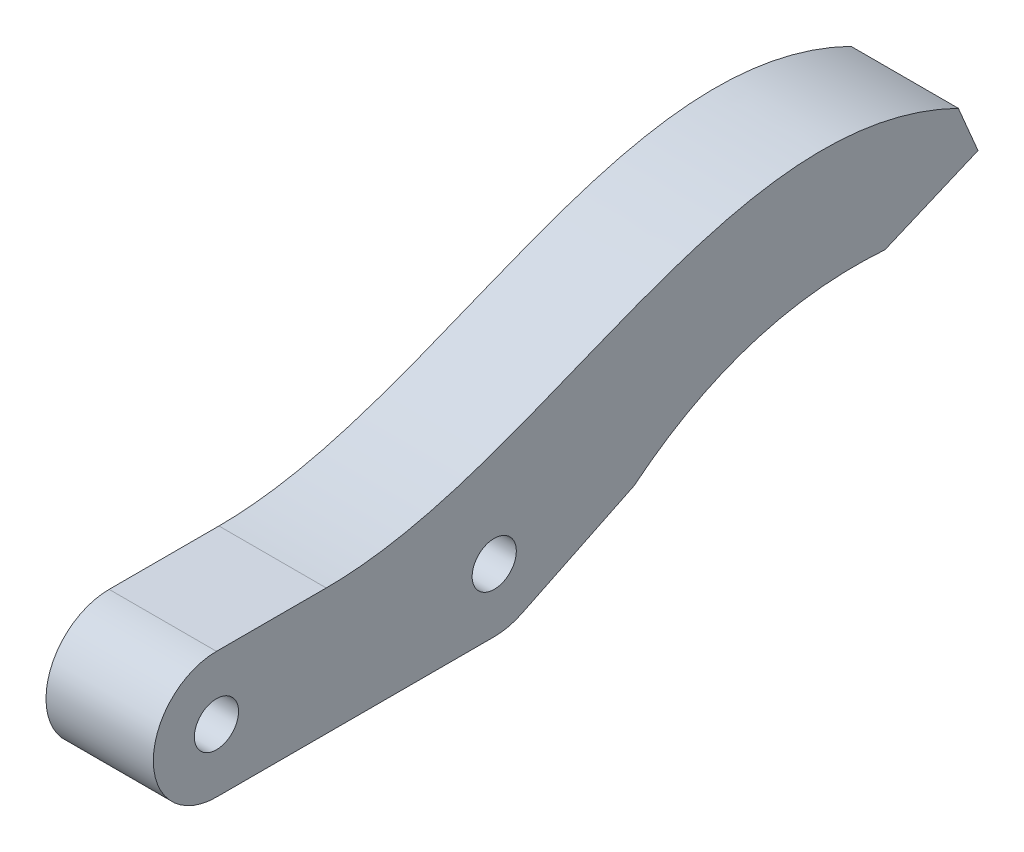
ISO-10303-21;
HEADER;
FILE_DESCRIPTION(('STEP AP214'),'2;1');
FILE_NAME('part.step','',(''),(''),'','','');
FILE_SCHEMA(('AUTOMOTIVE_DESIGN { 1 0 10303 214 1 1 1 1 }'));
ENDSEC;
DATA;
#1=APPLICATION_CONTEXT('core data for automotive mechanical design processes');
#2=APPLICATION_PROTOCOL_DEFINITION('international standard','automotive_design',2000,#1);
#3=PRODUCT_CONTEXT('',#1,'mechanical');
#4=PRODUCT('Part','Part','',(#3));
#5=PRODUCT_RELATED_PRODUCT_CATEGORY('part','',(#4));
#6=PRODUCT_DEFINITION_FORMATION('','',#4);
#7=PRODUCT_DEFINITION_CONTEXT('part definition',#1,'design');
#8=PRODUCT_DEFINITION('design','',#6,#7);
#9=PRODUCT_DEFINITION_SHAPE('','',#8);
#10=(LENGTH_UNIT() NAMED_UNIT(*) SI_UNIT(.MILLI.,.METRE.));
#11=(NAMED_UNIT(*) PLANE_ANGLE_UNIT() SI_UNIT($,.RADIAN.));
#12=(NAMED_UNIT(*) SI_UNIT($,.STERADIAN.) SOLID_ANGLE_UNIT());
#13=UNCERTAINTY_MEASURE_WITH_UNIT(LENGTH_MEASURE(1.E-05),#10,'distance_accuracy_value','');
#14=(GEOMETRIC_REPRESENTATION_CONTEXT(3) GLOBAL_UNCERTAINTY_ASSIGNED_CONTEXT((#13)) GLOBAL_UNIT_ASSIGNED_CONTEXT((#10,
#11,#12)) REPRESENTATION_CONTEXT('',''));
#15=CARTESIAN_POINT('',(0.,0.,0.));
#16=DIRECTION('',(0.,0.,1.));
#17=DIRECTION('',(1.,0.,0.));
#18=AXIS2_PLACEMENT_3D('',#15,#16,#17);
#19=CARTESIAN_POINT('',(8.5,5.,-27.));
#20=DIRECTION('',(-1.,0.,0.));
#21=DIRECTION('',(0.,0.,1.));
#22=AXIS2_PLACEMENT_3D('',#19,#20,#21);
#23=CYLINDRICAL_SURFACE('',#22,5.);
#24=DIRECTION('',(1.,0.,0.));
#25=VECTOR('',#24,1.);
#26=CARTESIAN_POINT('',(0.,0.502127655445501,-29.1838370754458));
#27=LINE('',#26,#25);
#28=CARTESIAN_POINT('',(0.,0.502127655445501,-29.1838370754458));
#29=VERTEX_POINT('',#28);
#30=CARTESIAN_POINT('',(8.5,0.502127655445501,-29.1838370754458));
#31=VERTEX_POINT('',#30);
#32=EDGE_CURVE('E200',#29,#31,#27,.T.);
#33=ORIENTED_EDGE('',*,*,#32,.T.);
#34=CARTESIAN_POINT('',(8.5,5.,-27.));
#35=DIRECTION('',(1.,0.,0.));
#36=DIRECTION('',(0.,0.,-1.));
#37=AXIS2_PLACEMENT_3D('',#34,#35,#36);
#38=CIRCLE('',#37,5.);
#39=CARTESIAN_POINT('',(8.5,0.,-27.));
#40=VERTEX_POINT('',#39);
#41=EDGE_CURVE('E212',#40,#31,#38,.T.);
#42=ORIENTED_EDGE('',*,*,#41,.F.);
#43=DIRECTION('',(-1.,0.,0.));
#44=VECTOR('',#43,1.);
#45=CARTESIAN_POINT('',(8.5,0.,-27.));
#46=LINE('',#45,#44);
#47=CARTESIAN_POINT('',(0.,0.,-27.));
#48=VERTEX_POINT('',#47);
#49=EDGE_CURVE('E220',#40,#48,#46,.T.);
#50=ORIENTED_EDGE('',*,*,#49,.T.);
#51=CARTESIAN_POINT('',(0.,5.,-27.));
#52=DIRECTION('',(1.,0.,0.));
#53=DIRECTION('',(0.,0.,-1.));
#54=AXIS2_PLACEMENT_3D('',#51,#52,#53);
#55=CIRCLE('',#54,5.);
#56=EDGE_CURVE('E224',#48,#29,#55,.T.);
#57=ORIENTED_EDGE('',*,*,#56,.T.);
#58=EDGE_LOOP('',(#33,#42,#50,#57));
#59=FACE_BOUND('',#58,.T.);
#60=ADVANCED_FACE('F45',(#59),#23,.T.);
#61=CARTESIAN_POINT('',(8.5,10.,0.));
#62=DIRECTION('',(0.,1.,0.));
#63=DIRECTION('',(0.,0.,1.));
#64=AXIS2_PLACEMENT_3D('',#61,#62,#63);
#65=PLANE('',#64);
#66=DIRECTION('',(1.,0.,0.));
#67=VECTOR('',#66,1.);
#68=CARTESIAN_POINT('',(0.,10.,-13.6949747586838));
#69=LINE('',#68,#67);
#70=CARTESIAN_POINT('',(0.,10.,-13.6949747586838));
#71=VERTEX_POINT('',#70);
#72=CARTESIAN_POINT('',(8.5,10.,-13.6949747586838));
#73=VERTEX_POINT('',#72);
#74=EDGE_CURVE('E135',#71,#73,#69,.T.);
#75=ORIENTED_EDGE('',*,*,#74,.F.);
#76=DIRECTION('',(0.,0.,-1.));
#77=VECTOR('',#76,1.);
#78=CARTESIAN_POINT('',(0.,10.,0.));
#79=LINE('',#78,#77);
#80=CARTESIAN_POINT('',(0.,10.,-5.));
#81=VERTEX_POINT('',#80);
#82=EDGE_CURVE('E146',#81,#71,#79,.T.);
#83=ORIENTED_EDGE('',*,*,#82,.F.);
#84=DIRECTION('',(-1.,0.,0.));
#85=VECTOR('',#84,1.);
#86=CARTESIAN_POINT('',(8.5,10.,-5.));
#87=LINE('',#86,#85);
#88=CARTESIAN_POINT('',(8.5,10.,-5.));
#89=VERTEX_POINT('',#88);
#90=EDGE_CURVE('E11',#89,#81,#87,.T.);
#91=ORIENTED_EDGE('',*,*,#90,.F.);
#92=DIRECTION('',(0.,0.,-1.));
#93=VECTOR('',#92,1.);
#94=CARTESIAN_POINT('',(8.5,10.,0.));
#95=LINE('',#94,#93);
#96=EDGE_CURVE('E199',#89,#73,#95,.T.);
#97=ORIENTED_EDGE('',*,*,#96,.T.);
#98=EDGE_LOOP('',(#75,#83,#91,#97));
#99=FACE_BOUND('',#98,.T.);
#100=ADVANCED_FACE('F47',(#99),#65,.T.);
#101=CARTESIAN_POINT('',(8.5,5.,-5.));
#102=DIRECTION('',(-1.,0.,0.));
#103=DIRECTION('',(0.,0.,1.));
#104=AXIS2_PLACEMENT_3D('',#101,#102,#103);
#105=CYLINDRICAL_SURFACE('',#104,5.);
#106=CARTESIAN_POINT('',(0.,5.,-5.));
#107=DIRECTION('',(1.,0.,0.));
#108=DIRECTION('',(0.,0.,-1.));
#109=AXIS2_PLACEMENT_3D('',#106,#107,#108);
#110=CIRCLE('',#109,5.);
#111=CARTESIAN_POINT('',(0.,0.,-5.));
#112=VERTEX_POINT('',#111);
#113=EDGE_CURVE('E75',#81,#112,#110,.T.);
#114=ORIENTED_EDGE('',*,*,#113,.T.);
#115=DIRECTION('',(-1.,0.,0.));
#116=VECTOR('',#115,1.);
#117=CARTESIAN_POINT('',(8.5,0.,-5.));
#118=LINE('',#117,#116);
#119=CARTESIAN_POINT('',(8.5,0.,-5.));
#120=VERTEX_POINT('',#119);
#121=EDGE_CURVE('E54',#120,#112,#118,.T.);
#122=ORIENTED_EDGE('',*,*,#121,.F.);
#123=CARTESIAN_POINT('',(8.5,5.,-5.));
#124=DIRECTION('',(1.,0.,0.));
#125=DIRECTION('',(0.,0.,-1.));
#126=AXIS2_PLACEMENT_3D('',#123,#124,#125);
#127=CIRCLE('',#126,5.);
#128=EDGE_CURVE('E208',#89,#120,#127,.T.);
#129=ORIENTED_EDGE('',*,*,#128,.F.);
#130=ORIENTED_EDGE('',*,*,#90,.T.);
#131=EDGE_LOOP('',(#114,#122,#129,#130));
#132=FACE_BOUND('',#131,.T.);
#133=ADVANCED_FACE('F191',(#132),#105,.T.);
#134=CARTESIAN_POINT('',(8.5,0.,0.));
#135=DIRECTION('',(0.,1.,0.));
#136=DIRECTION('',(0.,0.,1.));
#137=AXIS2_PLACEMENT_3D('',#134,#135,#136);
#138=PLANE('',#137);
#139=DIRECTION('',(0.,0.,-1.));
#140=VECTOR('',#139,1.);
#141=CARTESIAN_POINT('',(0.,0.,0.));
#142=LINE('',#141,#140);
#143=EDGE_CURVE('E80',#112,#48,#142,.T.);
#144=ORIENTED_EDGE('',*,*,#143,.T.);
#145=ORIENTED_EDGE('',*,*,#49,.F.);
#146=DIRECTION('',(0.,0.,-1.));
#147=VECTOR('',#146,1.);
#148=CARTESIAN_POINT('',(8.5,0.,0.));
#149=LINE('',#148,#147);
#150=EDGE_CURVE('E62',#120,#40,#149,.T.);
#151=ORIENTED_EDGE('',*,*,#150,.F.);
#152=ORIENTED_EDGE('',*,*,#121,.T.);
#153=EDGE_LOOP('',(#144,#145,#151,#152));
#154=FACE_BOUND('',#153,.T.);
#155=ADVANCED_FACE('F185',(#154),#138,.F.);
#156=CARTESIAN_POINT('',(8.5,5.,-5.));
#157=DIRECTION('',(-1.,0.,0.));
#158=DIRECTION('',(0.,0.,1.));
#159=AXIS2_PLACEMENT_3D('',#156,#157,#158);
#160=CYLINDRICAL_SURFACE('',#159,1.75);
#161=CARTESIAN_POINT('',(8.5,5.,-5.));
#162=DIRECTION('',(1.,0.,0.));
#163=DIRECTION('',(0.,0.,-1.));
#164=AXIS2_PLACEMENT_3D('',#161,#162,#163);
#165=CIRCLE('',#164,1.75);
#166=CARTESIAN_POINT('',(8.5,5.,-6.75));
#167=VERTEX_POINT('',#166);
#168=EDGE_CURVE('E214',#167,#167,#165,.T.);
#169=ORIENTED_EDGE('',*,*,#168,.T.);
#170=EDGE_LOOP('',(#169));
#171=FACE_BOUND('',#170,.T.);
#172=CARTESIAN_POINT('',(0.,5.,-5.));
#173=DIRECTION('',(1.,0.,0.));
#174=DIRECTION('',(0.,0.,-1.));
#175=AXIS2_PLACEMENT_3D('',#172,#173,#174);
#176=CIRCLE('',#175,1.75);
#177=CARTESIAN_POINT('',(0.,5.,-6.75));
#178=VERTEX_POINT('',#177);
#179=EDGE_CURVE('E227',#178,#178,#176,.T.);
#180=ORIENTED_EDGE('',*,*,#179,.F.);
#181=EDGE_LOOP('',(#180));
#182=FACE_BOUND('',#181,.T.);
#183=ADVANCED_FACE('F181',(#171,#182),#160,.F.);
#184=CARTESIAN_POINT('',(8.5,5.,-27.));
#185=DIRECTION('',(-1.,0.,0.));
#186=DIRECTION('',(0.,0.,1.));
#187=AXIS2_PLACEMENT_3D('',#184,#185,#186);
#188=CYLINDRICAL_SURFACE('',#187,1.75);
#189=CARTESIAN_POINT('',(8.5,5.,-27.));
#190=DIRECTION('',(1.,0.,0.));
#191=DIRECTION('',(0.,0.,-1.));
#192=AXIS2_PLACEMENT_3D('',#189,#190,#191);
#193=CIRCLE('',#192,1.75);
#194=CARTESIAN_POINT('',(8.5,5.,-28.75));
#195=VERTEX_POINT('',#194);
#196=EDGE_CURVE('E217',#195,#195,#193,.T.);
#197=ORIENTED_EDGE('',*,*,#196,.T.);
#198=EDGE_LOOP('',(#197));
#199=FACE_BOUND('',#198,.T.);
#200=CARTESIAN_POINT('',(0.,5.,-27.));
#201=DIRECTION('',(1.,0.,0.));
#202=DIRECTION('',(0.,0.,-1.));
#203=AXIS2_PLACEMENT_3D('',#200,#201,#202);
#204=CIRCLE('',#203,1.75);
#205=CARTESIAN_POINT('',(0.,5.,-28.75));
#206=VERTEX_POINT('',#205);
#207=EDGE_CURVE('E209',#206,#206,#204,.T.);
#208=ORIENTED_EDGE('',*,*,#207,.F.);
#209=EDGE_LOOP('',(#208));
#210=FACE_BOUND('',#209,.T.);
#211=ADVANCED_FACE('F176',(#199,#210),#188,.F.);
#212=CARTESIAN_POINT('',(8.5,0.,0.));
#213=DIRECTION('',(1.,0.,0.));
#214=DIRECTION('',(0.,0.,-1.));
#215=AXIS2_PLACEMENT_3D('',#212,#213,#214);
#216=PLANE('',#215);
#217=ORIENTED_EDGE('',*,*,#96,.F.);
#218=ORIENTED_EDGE('',*,*,#128,.T.);
#219=ORIENTED_EDGE('',*,*,#150,.T.);
#220=ORIENTED_EDGE('',*,*,#41,.T.);
#221=DIRECTION('',(0.,0.436767415089167,-0.8995744689109));
#222=VECTOR('',#221,1.);
#223=CARTESIAN_POINT('',(8.5,-11.0601312365663,-5.36998891997289));
#224=LINE('',#223,#222);
#225=CARTESIAN_POINT('',(8.5,4.82408407678908,-38.0854206599091));
#226=VERTEX_POINT('',#225);
#227=EDGE_CURVE('E240',#31,#226,#224,.T.);
#228=ORIENTED_EDGE('',*,*,#227,.T.);
#229=CARTESIAN_POINT('',(8.5,4.82408407678908,-38.0854206599091));
#230=CARTESIAN_POINT('',(8.5,11.8952224566425,-46.7975095094647));
#231=CARTESIAN_POINT('',(8.5,11.0678436667493,-57.9480004086976));
#232=B_SPLINE_CURVE_WITH_KNOTS('',2,(#229,#230,#231),.UNSPECIFIED.,.F.,.F.,(3,3),(0.,1.),.UNSPECIFIED.);
#233=CARTESIAN_POINT('',(8.5,11.0678436667493,-57.9480004086976));
#234=VERTEX_POINT('',#233);
#235=EDGE_CURVE('E154',#226,#234,#232,.T.);
#236=ORIENTED_EDGE('',*,*,#235,.T.);
#237=DIRECTION('',(0.,0.39020935118337,-0.920726160293631));
#238=VECTOR('',#237,1.);
#239=CARTESIAN_POINT('',(8.5,-11.4367064909869,-4.84694582599828));
#240=LINE('',#239,#238);
#241=CARTESIAN_POINT('',(8.5,14.1895184762162,-65.3138096910467));
#242=VERTEX_POINT('',#241);
#243=EDGE_CURVE('E151',#234,#242,#240,.T.);
#244=ORIENTED_EDGE('',*,*,#243,.T.);
#245=DIRECTION('',(0.,0.920726160293631,0.39020935118337));
#246=VECTOR('',#245,1.);
#247=CARTESIAN_POINT('',(8.5,25.6262249672031,-60.4668638650484));
#248=LINE('',#247,#246);
#249=CARTESIAN_POINT('',(8.5,17.8724231173908,-63.7529722863132));
#250=VERTEX_POINT('',#249);
#251=EDGE_CURVE('E246',#242,#250,#248,.T.);
#252=ORIENTED_EDGE('',*,*,#251,.T.);
#253=CARTESIAN_POINT('',(8.5,17.8724231173908,-63.7529722863132));
#254=CARTESIAN_POINT('',(8.5,26.563787962677,-45.9288826779558));
#255=CARTESIAN_POINT('',(8.5,10.,-31.059268620705));
#256=CARTESIAN_POINT('',(8.5,10.,-13.6949747586838));
#257=B_SPLINE_CURVE_WITH_KNOTS('',3,(#253,#254,#255,#256),.UNSPECIFIED.,.F.,.F.,(4,4),(0.,1.),.UNSPECIFIED.);
#258=EDGE_CURVE('E130',#250,#73,#257,.T.);
#259=ORIENTED_EDGE('',*,*,#258,.T.);
#260=EDGE_LOOP('',(#217,#218,#219,#220,#228,#236,#244,#252,#259));
#261=FACE_BOUND('',#260,.T.);
#262=ORIENTED_EDGE('',*,*,#168,.F.);
#263=EDGE_LOOP('',(#262));
#264=FACE_BOUND('',#263,.T.);
#265=ORIENTED_EDGE('',*,*,#196,.F.);
#266=EDGE_LOOP('',(#265));
#267=FACE_BOUND('',#266,.T.);
#268=ADVANCED_FACE('F173',(#261,#264,#267),#216,.T.);
#269=CARTESIAN_POINT('',(0.,0.,0.));
#270=DIRECTION('',(1.,0.,0.));
#271=DIRECTION('',(0.,0.,-1.));
#272=AXIS2_PLACEMENT_3D('',#269,#270,#271);
#273=PLANE('',#272);
#274=ORIENTED_EDGE('',*,*,#82,.T.);
#275=CARTESIAN_POINT('',(0.,17.8724231173908,-63.7529722863132));
#276=CARTESIAN_POINT('',(0.,26.563787962677,-45.9288826779558));
#277=CARTESIAN_POINT('',(0.,10.,-31.059268620705));
#278=CARTESIAN_POINT('',(0.,10.,-13.6949747586838));
#279=B_SPLINE_CURVE_WITH_KNOTS('',3,(#275,#276,#277,#278),.UNSPECIFIED.,.F.,.F.,(4,4),(0.,1.),.UNSPECIFIED.);
#280=CARTESIAN_POINT('',(0.,17.8724231173908,-63.7529722863132));
#281=VERTEX_POINT('',#280);
#282=EDGE_CURVE('E127',#281,#71,#279,.T.);
#283=ORIENTED_EDGE('',*,*,#282,.F.);
#284=DIRECTION('',(0.,0.920726160293631,0.39020935118337));
#285=VECTOR('',#284,1.);
#286=CARTESIAN_POINT('',(0.,25.6262249672031,-60.4668638650484));
#287=LINE('',#286,#285);
#288=CARTESIAN_POINT('',(0.,14.1895184762162,-65.3138096910467));
#289=VERTEX_POINT('',#288);
#290=EDGE_CURVE('E144',#289,#281,#287,.T.);
#291=ORIENTED_EDGE('',*,*,#290,.F.);
#292=DIRECTION('',(0.,0.39020935118337,-0.920726160293631));
#293=VECTOR('',#292,1.);
#294=CARTESIAN_POINT('',(0.,-11.4367064909869,-4.84694582599828));
#295=LINE('',#294,#293);
#296=CARTESIAN_POINT('',(0.,11.0678436667493,-57.9480004086976));
#297=VERTEX_POINT('',#296);
#298=EDGE_CURVE('E136',#297,#289,#295,.T.);
#299=ORIENTED_EDGE('',*,*,#298,.F.);
#300=CARTESIAN_POINT('',(0.,4.82408407678908,-38.0854206599091));
#301=CARTESIAN_POINT('',(0.,11.8952224566425,-46.7975095094647));
#302=CARTESIAN_POINT('',(0.,11.0678436667493,-57.9480004086976));
#303=B_SPLINE_CURVE_WITH_KNOTS('',2,(#300,#301,#302),.UNSPECIFIED.,.F.,.F.,(3,3),(0.,1.),.UNSPECIFIED.);
#304=CARTESIAN_POINT('',(0.,4.82408407678908,-38.0854206599091));
#305=VERTEX_POINT('',#304);
#306=EDGE_CURVE('E262',#305,#297,#303,.T.);
#307=ORIENTED_EDGE('',*,*,#306,.F.);
#308=DIRECTION('',(0.,0.436767415089167,-0.8995744689109));
#309=VECTOR('',#308,1.);
#310=CARTESIAN_POINT('',(0.,-11.0601312365663,-5.36998891997289));
#311=LINE('',#310,#309);
#312=EDGE_CURVE('E147',#29,#305,#311,.T.);
#313=ORIENTED_EDGE('',*,*,#312,.F.);
#314=ORIENTED_EDGE('',*,*,#56,.F.);
#315=ORIENTED_EDGE('',*,*,#143,.F.);
#316=ORIENTED_EDGE('',*,*,#113,.F.);
#317=EDGE_LOOP('',(#274,#283,#291,#299,#307,#313,#314,#315,#316));
#318=FACE_BOUND('',#317,.T.);
#319=ORIENTED_EDGE('',*,*,#179,.T.);
#320=EDGE_LOOP('',(#319));
#321=FACE_BOUND('',#320,.T.);
#322=ORIENTED_EDGE('',*,*,#207,.T.);
#323=EDGE_LOOP('',(#322));
#324=FACE_BOUND('',#323,.T.);
#325=ADVANCED_FACE('F141',(#318,#321,#324),#273,.F.);
#326=CARTESIAN_POINT('',(0.,25.6262249672031,-60.4668638650484));
#327=DIRECTION('',(0.,0.39020935118337,-0.920726160293631));
#328=DIRECTION('',(0.,0.920726160293631,0.39020935118337));
#329=AXIS2_PLACEMENT_3D('',#326,#327,#328);
#330=PLANE('',#329);
#331=ORIENTED_EDGE('',*,*,#251,.F.);
#332=DIRECTION('',(1.,0.,0.));
#333=VECTOR('',#332,1.);
#334=CARTESIAN_POINT('',(0.,14.1895184762162,-65.3138096910467));
#335=LINE('',#334,#333);
#336=EDGE_CURVE('E150',#289,#242,#335,.T.);
#337=ORIENTED_EDGE('',*,*,#336,.F.);
#338=ORIENTED_EDGE('',*,*,#290,.T.);
#339=DIRECTION('',(1.,0.,0.));
#340=VECTOR('',#339,1.);
#341=CARTESIAN_POINT('',(0.,17.8724231173908,-63.7529722863132));
#342=LINE('',#341,#340);
#343=EDGE_CURVE('E124',#281,#250,#342,.T.);
#344=ORIENTED_EDGE('',*,*,#343,.T.);
#345=EDGE_LOOP('',(#331,#337,#338,#344));
#346=FACE_BOUND('',#345,.T.);
#347=ADVANCED_FACE('F149',(#346),#330,.T.);
#348=CARTESIAN_POINT('',(0.,-11.4367064909869,-4.84694582599828));
#349=DIRECTION('',(0.,-0.920726160293631,-0.39020935118337));
#350=DIRECTION('',(0.,0.39020935118337,-0.920726160293631));
#351=AXIS2_PLACEMENT_3D('',#348,#349,#350);
#352=PLANE('',#351);
#353=ORIENTED_EDGE('',*,*,#243,.F.);
#354=DIRECTION('',(1.,0.,0.));
#355=VECTOR('',#354,1.);
#356=CARTESIAN_POINT('',(0.,11.0678436667493,-57.9480004086976));
#357=LINE('',#356,#355);
#358=EDGE_CURVE('E258',#297,#234,#357,.T.);
#359=ORIENTED_EDGE('',*,*,#358,.F.);
#360=ORIENTED_EDGE('',*,*,#298,.T.);
#361=ORIENTED_EDGE('',*,*,#336,.T.);
#362=EDGE_LOOP('',(#353,#359,#360,#361));
#363=FACE_BOUND('',#362,.T.);
#364=ADVANCED_FACE('F172',(#363),#352,.T.);
#365=DIRECTION('',(1.,0.,0.));
#366=VECTOR('',#365,1.);
#367=SURFACE_OF_LINEAR_EXTRUSION('',#303,#366);
#368=ORIENTED_EDGE('',*,*,#235,.F.);
#369=DIRECTION('',(1.,0.,0.));
#370=VECTOR('',#369,1.);
#371=CARTESIAN_POINT('',(0.,4.82408407678908,-38.0854206599091));
#372=LINE('',#371,#370);
#373=EDGE_CURVE('E203',#305,#226,#372,.T.);
#374=ORIENTED_EDGE('',*,*,#373,.F.);
#375=ORIENTED_EDGE('',*,*,#306,.T.);
#376=ORIENTED_EDGE('',*,*,#358,.T.);
#377=EDGE_LOOP('',(#368,#374,#375,#376));
#378=FACE_BOUND('',#377,.T.);
#379=ADVANCED_FACE('F261',(#378),#367,.T.);
#380=CARTESIAN_POINT('',(0.,-11.0601312365663,-5.36998891997289));
#381=DIRECTION('',(0.,-0.8995744689109,-0.436767415089167));
#382=DIRECTION('',(0.,0.436767415089167,-0.8995744689109));
#383=AXIS2_PLACEMENT_3D('',#380,#381,#382);
#384=PLANE('',#383);
#385=ORIENTED_EDGE('',*,*,#227,.F.);
#386=ORIENTED_EDGE('',*,*,#32,.F.);
#387=ORIENTED_EDGE('',*,*,#312,.T.);
#388=ORIENTED_EDGE('',*,*,#373,.T.);
#389=EDGE_LOOP('',(#385,#386,#387,#388));
#390=FACE_BOUND('',#389,.T.);
#391=ADVANCED_FACE('F168',(#390),#384,.T.);
#392=DIRECTION('',(1.,0.,0.));
#393=VECTOR('',#392,1.);
#394=SURFACE_OF_LINEAR_EXTRUSION('',#279,#393);
#395=ORIENTED_EDGE('',*,*,#258,.F.);
#396=ORIENTED_EDGE('',*,*,#343,.F.);
#397=ORIENTED_EDGE('',*,*,#282,.T.);
#398=ORIENTED_EDGE('',*,*,#74,.T.);
#399=EDGE_LOOP('',(#395,#396,#397,#398));
#400=FACE_BOUND('',#399,.T.);
#401=ADVANCED_FACE('F126',(#400),#394,.T.);
#402=CLOSED_SHELL('',(#60,#100,#133,#155,#183,#211,#268,#325,#347,#364,#379,#391,#401));
#403=MANIFOLD_SOLID_BREP('B2',#402);
#404=ADVANCED_BREP_SHAPE_REPRESENTATION('',(#18,#403),#14);
#405=SHAPE_DEFINITION_REPRESENTATION(#9,#404);
ENDSEC;
END-ISO-10303-21;
